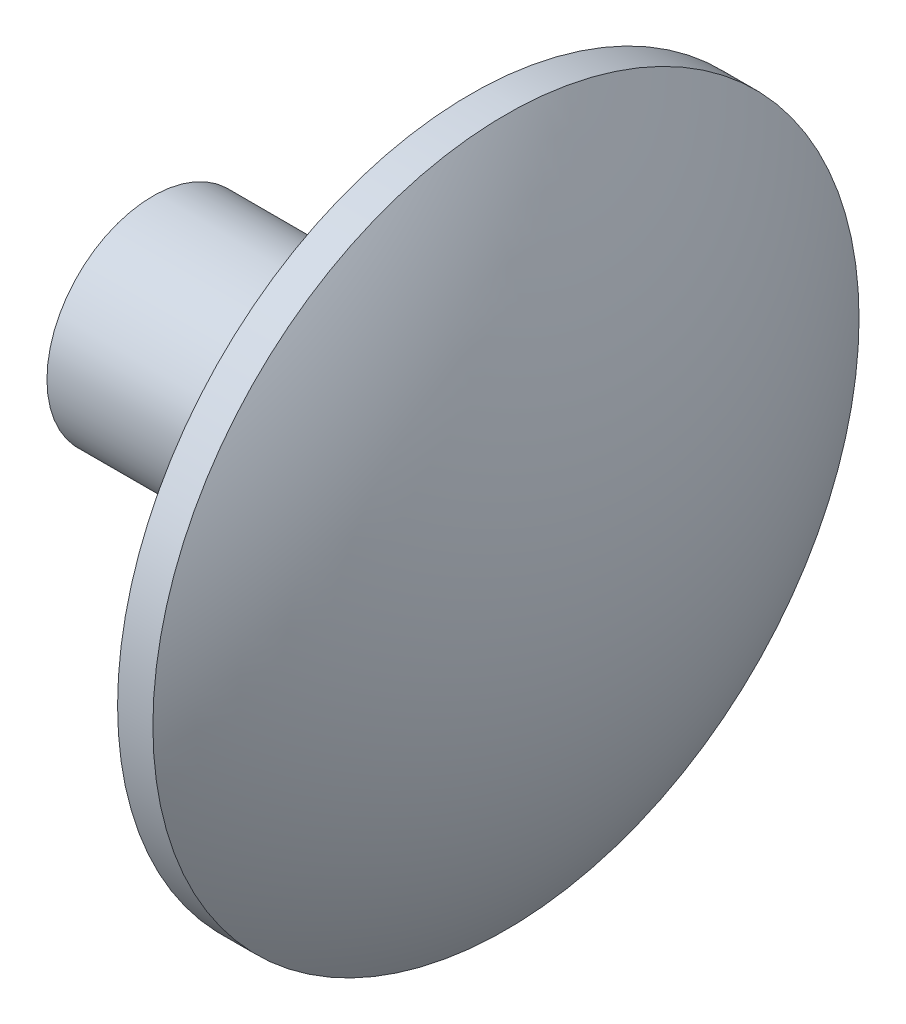
ISO-10303-21;
HEADER;
FILE_DESCRIPTION(('STEP AP214'),'2;1');
FILE_NAME('part.step','',(''),(''),'','','');
FILE_SCHEMA(('AUTOMOTIVE_DESIGN { 1 0 10303 214 1 1 1 1 }'));
ENDSEC;
DATA;
#1=APPLICATION_CONTEXT('core data for automotive mechanical design processes');
#2=APPLICATION_PROTOCOL_DEFINITION('international standard','automotive_design',2000,#1);
#3=PRODUCT_CONTEXT('',#1,'mechanical');
#4=PRODUCT('Part','Part','',(#3));
#5=PRODUCT_RELATED_PRODUCT_CATEGORY('part','',(#4));
#6=PRODUCT_DEFINITION_FORMATION('','',#4);
#7=PRODUCT_DEFINITION_CONTEXT('part definition',#1,'design');
#8=PRODUCT_DEFINITION('design','',#6,#7);
#9=PRODUCT_DEFINITION_SHAPE('','',#8);
#10=(LENGTH_UNIT() NAMED_UNIT(*) SI_UNIT(.MILLI.,.METRE.));
#11=(NAMED_UNIT(*) PLANE_ANGLE_UNIT() SI_UNIT($,.RADIAN.));
#12=(NAMED_UNIT(*) SI_UNIT($,.STERADIAN.) SOLID_ANGLE_UNIT());
#13=UNCERTAINTY_MEASURE_WITH_UNIT(LENGTH_MEASURE(1.E-05),#10,'distance_accuracy_value','');
#14=(GEOMETRIC_REPRESENTATION_CONTEXT(3) GLOBAL_UNCERTAINTY_ASSIGNED_CONTEXT((#13)) GLOBAL_UNIT_ASSIGNED_CONTEXT((#10,
#11,#12)) REPRESENTATION_CONTEXT('',''));
#15=CARTESIAN_POINT('',(0.,0.,0.));
#16=DIRECTION('',(0.,0.,1.));
#17=DIRECTION('',(1.,0.,0.));
#18=AXIS2_PLACEMENT_3D('',#15,#16,#17);
#19=CARTESIAN_POINT('',(-2.,0.,0.));
#20=DIRECTION('',(1.,0.,0.));
#21=DIRECTION('',(0.,0.,-1.));
#22=AXIS2_PLACEMENT_3D('',#19,#20,#21);
#23=PLANE('',#22);
#24=CARTESIAN_POINT('',(-2.,0.,0.));
#25=DIRECTION('',(-1.,0.,0.));
#26=DIRECTION('',(0.,0.,1.));
#27=AXIS2_PLACEMENT_3D('',#24,#25,#26);
#28=CIRCLE('',#27,3.);
#29=CARTESIAN_POINT('',(-2.,0.,3.00000000000006));
#30=VERTEX_POINT('',#29);
#31=CARTESIAN_POINT('',(-2.,3.,0.));
#32=VERTEX_POINT('',#31);
#33=EDGE_CURVE('E53',#30,#32,#28,.T.);
#34=ORIENTED_EDGE('',*,*,#33,.F.);
#35=DIRECTION('',(0.,0.999999999999999,0.));
#36=VECTOR('',#35,1.);
#37=CARTESIAN_POINT('',(-2.,3.00000000000004,3.00000000000003));
#38=LINE('',#37,#36);
#39=CARTESIAN_POINT('',(-2.,3.00000000000004,3.00000000000003));
#40=VERTEX_POINT('',#39);
#41=EDGE_CURVE('E125',#30,#40,#38,.T.);
#42=ORIENTED_EDGE('',*,*,#41,.T.);
#43=DIRECTION('',(0.,0.,-1.));
#44=VECTOR('',#43,1.);
#45=CARTESIAN_POINT('',(-2.,3.00000000000004,3.00000000000003));
#46=LINE('',#45,#44);
#47=EDGE_CURVE('E129',#40,#32,#46,.T.);
#48=ORIENTED_EDGE('',*,*,#47,.T.);
#49=EDGE_LOOP('',(#34,#42,#48));
#50=FACE_BOUND('',#49,.T.);
#51=ADVANCED_FACE('F42',(#50),#23,.F.);
#52=CARTESIAN_POINT('',(-1.99999999999999,0.,-3.));
#53=VERTEX_POINT('',#52);
#54=EDGE_CURVE('E11',#32,#53,#28,.T.);
#55=ORIENTED_EDGE('',*,*,#54,.F.);
#56=CARTESIAN_POINT('',(-2.,3.,-3.));
#57=VERTEX_POINT('',#56);
#58=EDGE_CURVE('E128',#32,#57,#46,.T.);
#59=ORIENTED_EDGE('',*,*,#58,.T.);
#60=DIRECTION('',(0.,-0.999999999999999,0.));
#61=VECTOR('',#60,1.);
#62=CARTESIAN_POINT('',(-2.,3.,-3.));
#63=LINE('',#62,#61);
#64=EDGE_CURVE('E118',#57,#53,#63,.T.);
#65=ORIENTED_EDGE('',*,*,#64,.T.);
#66=EDGE_LOOP('',(#55,#59,#65));
#67=FACE_BOUND('',#66,.T.);
#68=ADVANCED_FACE('F176',(#67),#23,.F.);
#69=CARTESIAN_POINT('',(-1.99999999999999,-2.99999999999998,0.));
#70=VERTEX_POINT('',#69);
#71=EDGE_CURVE('E51',#53,#70,#28,.T.);
#72=ORIENTED_EDGE('',*,*,#71,.F.);
#73=CARTESIAN_POINT('',(-1.99999999999999,-3.00000000000001,-2.99999999999998));
#74=VERTEX_POINT('',#73);
#75=EDGE_CURVE('E121',#53,#74,#63,.T.);
#76=ORIENTED_EDGE('',*,*,#75,.T.);
#77=DIRECTION('',(0.,0.,1.));
#78=VECTOR('',#77,1.);
#79=CARTESIAN_POINT('',(-2.,-2.99999999999995,3.00000000000003));
#80=LINE('',#79,#78);
#81=EDGE_CURVE('E122',#74,#70,#80,.T.);
#82=ORIENTED_EDGE('',*,*,#81,.T.);
#83=EDGE_LOOP('',(#72,#76,#82));
#84=FACE_BOUND('',#83,.T.);
#85=ADVANCED_FACE('F165',(#84),#23,.F.);
#86=CARTESIAN_POINT('',(0.,0.,0.));
#87=DIRECTION('',(1.,0.,0.));
#88=DIRECTION('',(0.,0.,-1.));
#89=AXIS2_PLACEMENT_3D('',#86,#87,#88);
#90=PLANE('',#89);
#91=CARTESIAN_POINT('',(0.,0.,0.));
#92=DIRECTION('',(1.,0.,0.));
#93=DIRECTION('',(0.,0.,-1.));
#94=AXIS2_PLACEMENT_3D('',#91,#92,#93);
#95=CIRCLE('',#94,10.);
#96=CARTESIAN_POINT('',(0.,0.,10.0000000000001));
#97=VERTEX_POINT('',#96);
#98=EDGE_CURVE('E46',#97,#97,#95,.T.);
#99=ORIENTED_EDGE('',*,*,#98,.F.);
#100=EDGE_LOOP('',(#99));
#101=FACE_BOUND('',#100,.T.);
#102=DIRECTION('',(0.,-0.999999999999999,0.));
#103=VECTOR('',#102,1.);
#104=CARTESIAN_POINT('',(0.,2.99999999999998,-3.00000000000001));
#105=LINE('',#104,#103);
#106=CARTESIAN_POINT('',(0.,2.99999999999998,-3.00000000000001));
#107=VERTEX_POINT('',#106);
#108=CARTESIAN_POINT('',(0.,-3.00000000000002,-2.99999999999998));
#109=VERTEX_POINT('',#108);
#110=EDGE_CURVE('E116',#107,#109,#105,.T.);
#111=ORIENTED_EDGE('',*,*,#110,.F.);
#112=DIRECTION('',(0.,0.,-1.));
#113=VECTOR('',#112,1.);
#114=CARTESIAN_POINT('',(0.,3.00000000000004,3.));
#115=LINE('',#114,#113);
#116=CARTESIAN_POINT('',(0.,3.00000000000004,3.));
#117=VERTEX_POINT('',#116);
#118=EDGE_CURVE('E141',#117,#107,#115,.T.);
#119=ORIENTED_EDGE('',*,*,#118,.F.);
#120=DIRECTION('',(0.,0.999999999999999,0.));
#121=VECTOR('',#120,1.);
#122=CARTESIAN_POINT('',(0.,3.00000000000004,3.));
#123=LINE('',#122,#121);
#124=CARTESIAN_POINT('',(0.,-2.99999999999998,3.00000000000003));
#125=VERTEX_POINT('',#124);
#126=EDGE_CURVE('E138',#125,#117,#123,.T.);
#127=ORIENTED_EDGE('',*,*,#126,.F.);
#128=DIRECTION('',(0.,0.,1.));
#129=VECTOR('',#128,1.);
#130=CARTESIAN_POINT('',(0.,-2.99999999999998,3.00000000000003));
#131=LINE('',#130,#129);
#132=EDGE_CURVE('E135',#109,#125,#131,.T.);
#133=ORIENTED_EDGE('',*,*,#132,.F.);
#134=EDGE_LOOP('',(#111,#119,#127,#133));
#135=FACE_BOUND('',#134,.T.);
#136=ADVANCED_FACE('F162',(#101,#135),#90,.F.);
#137=CARTESIAN_POINT('',(1.,0.,0.));
#138=DIRECTION('',(-1.,0.,0.));
#139=DIRECTION('',(0.,0.,1.));
#140=AXIS2_PLACEMENT_3D('',#137,#138,#139);
#141=CYLINDRICAL_SURFACE('',#140,10.);
#142=CARTESIAN_POINT('',(1.,0.,0.));
#143=DIRECTION('',(1.,0.,0.));
#144=DIRECTION('',(0.,0.,-1.));
#145=AXIS2_PLACEMENT_3D('',#142,#143,#144);
#146=CIRCLE('',#145,10.);
#147=CARTESIAN_POINT('',(1.,0.,10.0000000000001));
#148=VERTEX_POINT('',#147);
#149=EDGE_CURVE('E154',#148,#148,#146,.T.);
#150=CARTESIAN_POINT('',(1.,0.,10.0000000000001));
#151=CARTESIAN_POINT('',(0.989583333333335,0.,10.0000000000001));
#152=CARTESIAN_POINT('',(0.979166666666669,0.,10.0000000000001));
#153=CARTESIAN_POINT('',(0.958333333333335,0.,10.0000000000001));
#154=CARTESIAN_POINT('',(0.947916666666669,0.,10.0000000000001));
#155=CARTESIAN_POINT('',(0.927083333333335,0.,10.0000000000001));
#156=CARTESIAN_POINT('',(0.916666666666669,0.,10.0000000000001));
#157=CARTESIAN_POINT('',(0.895833333333335,0.,10.0000000000001));
#158=CARTESIAN_POINT('',(0.885416666666669,0.,10.0000000000001));
#159=CARTESIAN_POINT('',(0.864583333333335,0.,10.0000000000001));
#160=CARTESIAN_POINT('',(0.854166666666668,0.,10.0000000000001));
#161=CARTESIAN_POINT('',(0.833333333333335,0.,10.0000000000001));
#162=CARTESIAN_POINT('',(0.822916666666668,0.,10.0000000000001));
#163=CARTESIAN_POINT('',(0.802083333333335,0.,10.0000000000001));
#164=CARTESIAN_POINT('',(0.791666666666668,0.,10.0000000000001));
#165=CARTESIAN_POINT('',(0.770833333333335,0.,10.0000000000001));
#166=CARTESIAN_POINT('',(0.760416666666668,0.,10.0000000000001));
#167=CARTESIAN_POINT('',(0.739583333333335,0.,10.0000000000001));
#168=CARTESIAN_POINT('',(0.729166666666668,0.,10.0000000000001));
#169=CARTESIAN_POINT('',(0.708333333333335,0.,10.0000000000001));
#170=CARTESIAN_POINT('',(0.697916666666668,0.,10.0000000000001));
#171=CARTESIAN_POINT('',(0.677083333333335,0.,10.0000000000001));
#172=CARTESIAN_POINT('',(0.666666666666668,0.,10.0000000000001));
#173=CARTESIAN_POINT('',(0.645833333333335,0.,10.0000000000001));
#174=CARTESIAN_POINT('',(0.635416666666668,0.,10.0000000000001));
#175=CARTESIAN_POINT('',(0.614583333333335,0.,10.0000000000001));
#176=CARTESIAN_POINT('',(0.604166666666668,0.,10.0000000000001));
#177=CARTESIAN_POINT('',(0.583333333333335,0.,10.0000000000001));
#178=CARTESIAN_POINT('',(0.572916666666668,0.,10.0000000000001));
#179=CARTESIAN_POINT('',(0.552083333333335,0.,10.0000000000001));
#180=CARTESIAN_POINT('',(0.541666666666668,0.,10.0000000000001));
#181=CARTESIAN_POINT('',(0.520833333333335,0.,10.0000000000001));
#182=CARTESIAN_POINT('',(0.510416666666668,0.,10.0000000000001));
#183=CARTESIAN_POINT('',(0.489583333333335,0.,10.0000000000001));
#184=CARTESIAN_POINT('',(0.479166666666668,0.,10.0000000000001));
#185=CARTESIAN_POINT('',(0.458333333333335,0.,10.0000000000001));
#186=CARTESIAN_POINT('',(0.447916666666668,0.,10.0000000000001));
#187=CARTESIAN_POINT('',(0.427083333333335,0.,10.0000000000001));
#188=CARTESIAN_POINT('',(0.416666666666668,0.,10.0000000000001));
#189=CARTESIAN_POINT('',(0.395833333333335,0.,10.0000000000001));
#190=CARTESIAN_POINT('',(0.385416666666668,0.,10.0000000000001));
#191=CARTESIAN_POINT('',(0.364583333333335,0.,10.0000000000001));
#192=CARTESIAN_POINT('',(0.354166666666668,0.,10.0000000000001));
#193=CARTESIAN_POINT('',(0.333333333333335,0.,10.0000000000001));
#194=CARTESIAN_POINT('',(0.322916666666668,0.,10.0000000000001));
#195=CARTESIAN_POINT('',(0.302083333333335,0.,10.0000000000001));
#196=CARTESIAN_POINT('',(0.291666666666668,0.,10.0000000000001));
#197=CARTESIAN_POINT('',(0.270833333333335,0.,10.0000000000001));
#198=CARTESIAN_POINT('',(0.260416666666668,0.,10.0000000000001));
#199=CARTESIAN_POINT('',(0.239583333333335,0.,10.0000000000001));
#200=CARTESIAN_POINT('',(0.229166666666668,0.,10.0000000000001));
#201=CARTESIAN_POINT('',(0.208333333333334,0.,10.0000000000001));
#202=CARTESIAN_POINT('',(0.197916666666668,0.,10.0000000000001));
#203=CARTESIAN_POINT('',(0.177083333333334,0.,10.0000000000001));
#204=CARTESIAN_POINT('',(0.166666666666668,0.,10.0000000000001));
#205=CARTESIAN_POINT('',(0.145833333333334,0.,10.0000000000001));
#206=CARTESIAN_POINT('',(0.135416666666668,0.,10.0000000000001));
#207=CARTESIAN_POINT('',(0.114583333333334,0.,10.0000000000001));
#208=CARTESIAN_POINT('',(0.104166666666668,0.,10.0000000000001));
#209=CARTESIAN_POINT('',(0.0833333333333344,0.,10.0000000000001));
#210=CARTESIAN_POINT('',(0.0729166666666677,0.,10.0000000000001));
#211=CARTESIAN_POINT('',(0.0520833333333344,0.,10.0000000000001));
#212=CARTESIAN_POINT('',(0.0416666666666677,0.,10.0000000000001));
#213=CARTESIAN_POINT('',(0.0208333333333343,0.,10.0000000000001));
#214=CARTESIAN_POINT('',(0.0104166666666676,0.,10.0000000000001));
#215=CARTESIAN_POINT('',(0.,0.,10.0000000000001));
#216=B_SPLINE_CURVE_WITH_KNOTS('',3,(#150,#151,#152,#153,#154,#155,#156,#157,#158,#159,#160,
#161,#162,#163,#164,#165,#166,#167,#168,#169,#170,#171,#172,#173,#174,#175,#176,#177,#178,#179,
#180,#181,#182,#183,#184,#185,#186,#187,#188,#189,#190,#191,#192,#193,#194,#195,#196,#197,#198,
#199,#200,#201,#202,#203,#204,#205,#206,#207,#208,#209,#210,#211,#212,#213,#214,#215),
.UNSPECIFIED.,.F.,.F.,(4,2,2,2,2,2,2,2,2,2,2,2,2,2,2,2,2,2,2,2,2,2,2,2,2,2,2,2,2,2,2,2,4),(0.,
0.0312499999999999,0.0624999999999999,0.09375,0.125,0.15625,0.1875,0.21875,0.25,0.28125,0.3125,
0.34375,0.375,0.40625,0.4375,0.46875,0.5,0.53125,0.5625,0.59375,0.625,0.65625,0.687500000000001,
0.718750000000001,0.750000000000001,0.781250000000001,0.812500000000001,0.843750000000001,
0.875000000000001,0.906250000000001,0.937500000000001,0.968750000000001,1.),.UNSPECIFIED.);
#217=EDGE_CURVE('BSEAM44',#148,#97,#216,.T.);
#218=ORIENTED_EDGE('',*,*,#149,.F.);
#219=ORIENTED_EDGE('',*,*,#98,.T.);
#220=ORIENTED_EDGE('',*,*,#217,.T.);
#221=ORIENTED_EDGE('',*,*,#217,.F.);
#222=EDGE_LOOP('',(#218,#220,#219,#221));
#223=FACE_BOUND('',#222,.T.);
#224=ADVANCED_FACE('F44',(#223),#141,.T.);
#225=CARTESIAN_POINT('',(-14.1666666666667,0.,0.));
#226=DIRECTION('',(-1.,0.,0.));
#227=DIRECTION('',(0.,0.,-1.));
#228=AXIS2_PLACEMENT_3D('',#225,#226,#227);
#229=SPHERICAL_SURFACE('',#228,18.1666666666667);
#230=ORIENTED_EDGE('',*,*,#149,.T.);
#231=EDGE_LOOP('',(#230));
#232=FACE_BOUND('',#231,.T.);
#233=ADVANCED_FACE('F229',(#232),#229,.T.);
#234=CARTESIAN_POINT('',(-2.,3.,-3.));
#235=DIRECTION('',(0.,0.,1.));
#236=DIRECTION('',(0.,-0.999999999999999,0.));
#237=AXIS2_PLACEMENT_3D('',#234,#235,#236);
#238=PLANE('',#237);
#239=ORIENTED_EDGE('',*,*,#110,.T.);
#240=DIRECTION('',(1.,0.,0.));
#241=VECTOR('',#240,1.);
#242=CARTESIAN_POINT('',(-1.99999999999999,-3.00000000000001,-2.99999999999998));
#243=LINE('',#242,#241);
#244=EDGE_CURVE('E152',#74,#109,#243,.T.);
#245=ORIENTED_EDGE('',*,*,#244,.F.);
#246=ORIENTED_EDGE('',*,*,#75,.F.);
#247=ORIENTED_EDGE('',*,*,#64,.F.);
#248=DIRECTION('',(1.,0.,0.));
#249=VECTOR('',#248,1.);
#250=CARTESIAN_POINT('',(-2.,3.,-3.));
#251=LINE('',#250,#249);
#252=EDGE_CURVE('E132',#57,#107,#251,.T.);
#253=ORIENTED_EDGE('',*,*,#252,.T.);
#254=EDGE_LOOP('',(#239,#245,#246,#247,#253));
#255=FACE_BOUND('',#254,.T.);
#256=ADVANCED_FACE('F174',(#255),#238,.F.);
#257=CARTESIAN_POINT('',(-2.,-2.99999999999995,3.00000000000003));
#258=DIRECTION('',(0.,0.999999999999999,0.));
#259=DIRECTION('',(0.,0.,1.));
#260=AXIS2_PLACEMENT_3D('',#257,#258,#259);
#261=PLANE('',#260);
#262=ORIENTED_EDGE('',*,*,#132,.T.);
#263=DIRECTION('',(1.,0.,0.));
#264=VECTOR('',#263,1.);
#265=CARTESIAN_POINT('',(-2.,-2.99999999999995,3.00000000000003));
#266=LINE('',#265,#264);
#267=CARTESIAN_POINT('',(-2.,-2.99999999999995,3.00000000000003));
#268=VERTEX_POINT('',#267);
#269=EDGE_CURVE('E149',#268,#125,#266,.T.);
#270=ORIENTED_EDGE('',*,*,#269,.F.);
#271=EDGE_CURVE('E120',#70,#268,#80,.T.);
#272=ORIENTED_EDGE('',*,*,#271,.F.);
#273=ORIENTED_EDGE('',*,*,#81,.F.);
#274=ORIENTED_EDGE('',*,*,#244,.T.);
#275=EDGE_LOOP('',(#262,#270,#272,#273,#274));
#276=FACE_BOUND('',#275,.T.);
#277=ADVANCED_FACE('F188',(#276),#261,.F.);
#278=CARTESIAN_POINT('',(-2.,3.00000000000004,3.00000000000003));
#279=DIRECTION('',(0.,0.,-1.));
#280=DIRECTION('',(0.,0.999999999999999,0.));
#281=AXIS2_PLACEMENT_3D('',#278,#279,#280);
#282=PLANE('',#281);
#283=ORIENTED_EDGE('',*,*,#126,.T.);
#284=DIRECTION('',(1.,0.,0.));
#285=VECTOR('',#284,1.);
#286=CARTESIAN_POINT('',(-2.,3.00000000000004,3.00000000000003));
#287=LINE('',#286,#285);
#288=EDGE_CURVE('E146',#40,#117,#287,.T.);
#289=ORIENTED_EDGE('',*,*,#288,.F.);
#290=ORIENTED_EDGE('',*,*,#41,.F.);
#291=EDGE_CURVE('E126',#268,#30,#38,.T.);
#292=ORIENTED_EDGE('',*,*,#291,.F.);
#293=ORIENTED_EDGE('',*,*,#269,.T.);
#294=EDGE_LOOP('',(#283,#289,#290,#292,#293));
#295=FACE_BOUND('',#294,.T.);
#296=ADVANCED_FACE('F185',(#295),#282,.F.);
#297=CARTESIAN_POINT('',(-2.,3.00000000000004,3.00000000000003));
#298=DIRECTION('',(0.,-0.999999999999999,0.));
#299=DIRECTION('',(0.,0.,-1.));
#300=AXIS2_PLACEMENT_3D('',#297,#298,#299);
#301=PLANE('',#300);
#302=ORIENTED_EDGE('',*,*,#118,.T.);
#303=ORIENTED_EDGE('',*,*,#252,.F.);
#304=ORIENTED_EDGE('',*,*,#58,.F.);
#305=ORIENTED_EDGE('',*,*,#47,.F.);
#306=ORIENTED_EDGE('',*,*,#288,.T.);
#307=EDGE_LOOP('',(#302,#303,#304,#305,#306));
#308=FACE_BOUND('',#307,.T.);
#309=ADVANCED_FACE('F170',(#308),#301,.F.);
#310=EDGE_CURVE('E66',#70,#30,#28,.T.);
#311=ORIENTED_EDGE('',*,*,#310,.F.);
#312=ORIENTED_EDGE('',*,*,#271,.T.);
#313=ORIENTED_EDGE('',*,*,#291,.T.);
#314=EDGE_LOOP('',(#311,#312,#313));
#315=FACE_BOUND('',#314,.T.);
#316=ADVANCED_FACE('F193',(#315),#23,.F.);
#317=CARTESIAN_POINT('',(-8.99999999999999,0.,0.));
#318=DIRECTION('',(1.,0.,0.));
#319=DIRECTION('',(0.,0.,-1.));
#320=AXIS2_PLACEMENT_3D('',#317,#318,#319);
#321=CYLINDRICAL_SURFACE('',#320,3.);
#322=CARTESIAN_POINT('',(-8.99999999999999,0.,0.));
#323=DIRECTION('',(-1.,0.,0.));
#324=DIRECTION('',(0.,0.,1.));
#325=AXIS2_PLACEMENT_3D('',#322,#323,#324);
#326=CIRCLE('',#325,3.);
#327=CARTESIAN_POINT('',(-8.99999999999999,0.,3.));
#328=VERTEX_POINT('',#327);
#329=EDGE_CURVE('E111',#328,#328,#326,.T.);
#330=ORIENTED_EDGE('',*,*,#329,.F.);
#331=EDGE_LOOP('',(#330));
#332=FACE_BOUND('',#331,.T.);
#333=ORIENTED_EDGE('',*,*,#33,.T.);
#334=ORIENTED_EDGE('',*,*,#54,.T.);
#335=ORIENTED_EDGE('',*,*,#71,.T.);
#336=ORIENTED_EDGE('',*,*,#310,.T.);
#337=EDGE_LOOP('',(#333,#334,#335,#336));
#338=FACE_BOUND('',#337,.T.);
#339=ADVANCED_FACE('F179',(#332,#338),#321,.T.);
#340=CARTESIAN_POINT('',(-8.99999999999999,0.,0.));
#341=DIRECTION('',(-1.,0.,0.));
#342=DIRECTION('',(0.,0.,1.));
#343=AXIS2_PLACEMENT_3D('',#340,#341,#342);
#344=PLANE('',#343);
#345=CARTESIAN_POINT('',(-9.,0.,0.));
#346=DIRECTION('',(-1.,0.,0.));
#347=DIRECTION('',(0.,0.,1.));
#348=AXIS2_PLACEMENT_3D('',#345,#346,#347);
#349=CIRCLE('',#348,2.09999999999999);
#350=CARTESIAN_POINT('',(-9.,0.,2.09999999999999));
#351=VERTEX_POINT('',#350);
#352=EDGE_CURVE('E108',#351,#351,#349,.T.);
#353=ORIENTED_EDGE('',*,*,#352,.F.);
#354=EDGE_LOOP('',(#353));
#355=FACE_BOUND('',#354,.T.);
#356=ORIENTED_EDGE('',*,*,#329,.T.);
#357=EDGE_LOOP('',(#356));
#358=FACE_BOUND('',#357,.T.);
#359=ADVANCED_FACE('F102',(#355,#358),#344,.T.);
#360=CARTESIAN_POINT('',(-2.,0.,0.));
#361=DIRECTION('',(-1.,0.,0.));
#362=DIRECTION('',(0.,0.,1.));
#363=AXIS2_PLACEMENT_3D('',#360,#361,#362);
#364=CONICAL_SURFACE('',#363,2.1,1.02974425867665);
#365=CARTESIAN_POINT('',(-0.738192700042124,0.,0.));
#366=VERTEX_POINT('',#365);
#367=VERTEX_LOOP('',#366);
#368=FACE_BOUND('',#367,.T.);
#369=CARTESIAN_POINT('',(-2.,0.,0.));
#370=DIRECTION('',(-1.,0.,0.));
#371=DIRECTION('',(0.,0.,1.));
#372=AXIS2_PLACEMENT_3D('',#369,#370,#371);
#373=CIRCLE('',#372,2.1);
#374=CARTESIAN_POINT('',(-2.,0.,2.09999999999999));
#375=VERTEX_POINT('',#374);
#376=EDGE_CURVE('E106',#375,#375,#373,.T.);
#377=ORIENTED_EDGE('',*,*,#376,.T.);
#378=EDGE_LOOP('',(#377));
#379=FACE_BOUND('',#378,.T.);
#380=ADVANCED_FACE('F98',(#368,#379),#364,.F.);
#381=CARTESIAN_POINT('',(-8.99999999999999,0.,0.));
#382=DIRECTION('',(-1.,0.,0.));
#383=DIRECTION('',(0.,0.,1.));
#384=AXIS2_PLACEMENT_3D('',#381,#382,#383);
#385=CYLINDRICAL_SURFACE('',#384,2.09999999999999);
#386=CARTESIAN_POINT('',(-2.,0.,2.09999999999999));
#387=CARTESIAN_POINT('',(-2.07291666666666,0.,2.09999999999999));
#388=CARTESIAN_POINT('',(-2.14583333333333,0.,2.09999999999999));
#389=CARTESIAN_POINT('',(-2.29166666666666,0.,2.09999999999999));
#390=CARTESIAN_POINT('',(-2.36458333333333,0.,2.09999999999999));
#391=CARTESIAN_POINT('',(-2.51041666666666,0.,2.09999999999999));
#392=CARTESIAN_POINT('',(-2.58333333333333,0.,2.09999999999999));
#393=CARTESIAN_POINT('',(-2.72916666666666,0.,2.09999999999999));
#394=CARTESIAN_POINT('',(-2.80208333333333,0.,2.09999999999999));
#395=CARTESIAN_POINT('',(-2.94791666666666,0.,2.09999999999999));
#396=CARTESIAN_POINT('',(-3.02083333333333,0.,2.09999999999999));
#397=CARTESIAN_POINT('',(-3.16666666666666,0.,2.09999999999999));
#398=CARTESIAN_POINT('',(-3.23958333333333,0.,2.09999999999999));
#399=CARTESIAN_POINT('',(-3.38541666666666,0.,2.09999999999999));
#400=CARTESIAN_POINT('',(-3.45833333333333,0.,2.09999999999999));
#401=CARTESIAN_POINT('',(-3.60416666666666,0.,2.09999999999999));
#402=CARTESIAN_POINT('',(-3.67708333333333,0.,2.09999999999999));
#403=CARTESIAN_POINT('',(-3.82291666666666,0.,2.09999999999999));
#404=CARTESIAN_POINT('',(-3.89583333333333,0.,2.09999999999999));
#405=CARTESIAN_POINT('',(-4.04166666666666,0.,2.09999999999999));
#406=CARTESIAN_POINT('',(-4.11458333333333,0.,2.09999999999999));
#407=CARTESIAN_POINT('',(-4.26041666666666,0.,2.09999999999999));
#408=CARTESIAN_POINT('',(-4.33333333333333,0.,2.09999999999999));
#409=CARTESIAN_POINT('',(-4.47916666666666,0.,2.09999999999999));
#410=CARTESIAN_POINT('',(-4.55208333333333,0.,2.09999999999999));
#411=CARTESIAN_POINT('',(-4.69791666666666,0.,2.09999999999999));
#412=CARTESIAN_POINT('',(-4.77083333333333,0.,2.09999999999999));
#413=CARTESIAN_POINT('',(-4.91666666666666,0.,2.09999999999999));
#414=CARTESIAN_POINT('',(-4.98958333333333,0.,2.09999999999999));
#415=CARTESIAN_POINT('',(-5.13541666666666,0.,2.09999999999999));
#416=CARTESIAN_POINT('',(-5.20833333333333,0.,2.09999999999999));
#417=CARTESIAN_POINT('',(-5.35416666666666,0.,2.09999999999999));
#418=CARTESIAN_POINT('',(-5.42708333333333,0.,2.09999999999999));
#419=CARTESIAN_POINT('',(-5.57291666666666,0.,2.09999999999999));
#420=CARTESIAN_POINT('',(-5.64583333333333,0.,2.09999999999999));
#421=CARTESIAN_POINT('',(-5.79166666666666,0.,2.09999999999999));
#422=CARTESIAN_POINT('',(-5.86458333333333,0.,2.09999999999999));
#423=CARTESIAN_POINT('',(-6.01041666666666,0.,2.09999999999999));
#424=CARTESIAN_POINT('',(-6.08333333333333,0.,2.09999999999999));
#425=CARTESIAN_POINT('',(-6.22916666666666,0.,2.09999999999999));
#426=CARTESIAN_POINT('',(-6.30208333333333,0.,2.09999999999999));
#427=CARTESIAN_POINT('',(-6.44791666666666,0.,2.09999999999999));
#428=CARTESIAN_POINT('',(-6.52083333333333,0.,2.09999999999999));
#429=CARTESIAN_POINT('',(-6.66666666666666,0.,2.09999999999999));
#430=CARTESIAN_POINT('',(-6.73958333333333,0.,2.09999999999999));
#431=CARTESIAN_POINT('',(-6.88541666666666,0.,2.09999999999999));
#432=CARTESIAN_POINT('',(-6.95833333333333,0.,2.09999999999999));
#433=CARTESIAN_POINT('',(-7.10416666666666,0.,2.09999999999999));
#434=CARTESIAN_POINT('',(-7.17708333333333,0.,2.09999999999999));
#435=CARTESIAN_POINT('',(-7.32291666666666,0.,2.09999999999999));
#436=CARTESIAN_POINT('',(-7.39583333333333,0.,2.09999999999999));
#437=CARTESIAN_POINT('',(-7.54166666666666,0.,2.09999999999999));
#438=CARTESIAN_POINT('',(-7.61458333333333,0.,2.09999999999999));
#439=CARTESIAN_POINT('',(-7.76041666666666,0.,2.09999999999999));
#440=CARTESIAN_POINT('',(-7.83333333333333,0.,2.09999999999999));
#441=CARTESIAN_POINT('',(-7.97916666666666,0.,2.09999999999999));
#442=CARTESIAN_POINT('',(-8.05208333333333,0.,2.09999999999999));
#443=CARTESIAN_POINT('',(-8.19791666666666,0.,2.09999999999999));
#444=CARTESIAN_POINT('',(-8.27083333333333,0.,2.09999999999999));
#445=CARTESIAN_POINT('',(-8.41666666666666,0.,2.09999999999999));
#446=CARTESIAN_POINT('',(-8.48958333333333,0.,2.09999999999999));
#447=CARTESIAN_POINT('',(-8.63541666666666,0.,2.09999999999999));
#448=CARTESIAN_POINT('',(-8.70833333333333,0.,2.09999999999999));
#449=CARTESIAN_POINT('',(-8.85416666666666,0.,2.09999999999999));
#450=CARTESIAN_POINT('',(-8.92708333333333,0.,2.09999999999999));
#451=CARTESIAN_POINT('',(-8.99999999999999,0.,2.09999999999999));
#452=B_SPLINE_CURVE_WITH_KNOTS('',3,(#386,#387,#388,#389,#390,#391,#392,#393,#394,#395,#396,
#397,#398,#399,#400,#401,#402,#403,#404,#405,#406,#407,#408,#409,#410,#411,#412,#413,#414,#415,
#416,#417,#418,#419,#420,#421,#422,#423,#424,#425,#426,#427,#428,#429,#430,#431,#432,#433,#434,
#435,#436,#437,#438,#439,#440,#441,#442,#443,#444,#445,#446,#447,#448,#449,#450,#451),
.UNSPECIFIED.,.F.,.F.,(4,2,2,2,2,2,2,2,2,2,2,2,2,2,2,2,2,2,2,2,2,2,2,2,2,2,2,2,2,2,2,2,4),(0.,
0.218749999999999,0.4375,0.656249999999999,0.874999999999999,1.09375,1.3125,1.53125,1.75,
1.96875,2.1875,2.40625,2.625,2.84375,3.0625,3.28125,3.5,3.71875,3.9375,4.15625,4.375,4.59375,
4.8125,5.03125,5.25,5.46875,5.6875,5.90625,6.125,6.34375,6.5625,6.78125,7.),.UNSPECIFIED.);
#453=EDGE_CURVE('BSEAM101',#375,#351,#452,.T.);
#454=ORIENTED_EDGE('',*,*,#376,.F.);
#455=ORIENTED_EDGE('',*,*,#352,.T.);
#456=ORIENTED_EDGE('',*,*,#453,.T.);
#457=ORIENTED_EDGE('',*,*,#453,.F.);
#458=EDGE_LOOP('',(#454,#456,#455,#457));
#459=FACE_BOUND('',#458,.T.);
#460=ADVANCED_FACE('F101',(#459),#385,.F.);
#461=CLOSED_SHELL('',(#51,#68,#85,#136,#224,#233,#256,#277,#296,#309,#316,#339,#359,#380,#460));
#462=MANIFOLD_SOLID_BREP('B2',#461);
#463=ADVANCED_BREP_SHAPE_REPRESENTATION('',(#18,#462),#14);
#464=SHAPE_DEFINITION_REPRESENTATION(#9,#463);
ENDSEC;
END-ISO-10303-21;
